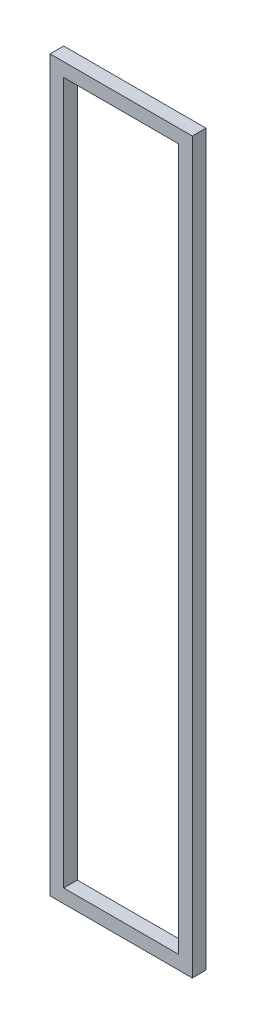
ISO-10303-21;
HEADER;
FILE_DESCRIPTION(('STEP AP214'),'2;1');
FILE_NAME('part.step','',(''),(''),'','','');
FILE_SCHEMA(('AUTOMOTIVE_DESIGN { 1 0 10303 214 1 1 1 1 }'));
ENDSEC;
DATA;
#1=APPLICATION_CONTEXT('core data for automotive mechanical design processes');
#2=APPLICATION_PROTOCOL_DEFINITION('international standard','automotive_design',2000,#1);
#3=PRODUCT_CONTEXT('',#1,'mechanical');
#4=PRODUCT('Part','Part','',(#3));
#5=PRODUCT_RELATED_PRODUCT_CATEGORY('part','',(#4));
#6=PRODUCT_DEFINITION_FORMATION('','',#4);
#7=PRODUCT_DEFINITION_CONTEXT('part definition',#1,'design');
#8=PRODUCT_DEFINITION('design','',#6,#7);
#9=PRODUCT_DEFINITION_SHAPE('','',#8);
#10=(LENGTH_UNIT() NAMED_UNIT(*) SI_UNIT(.MILLI.,.METRE.));
#11=(NAMED_UNIT(*) PLANE_ANGLE_UNIT() SI_UNIT($,.RADIAN.));
#12=(NAMED_UNIT(*) SI_UNIT($,.STERADIAN.) SOLID_ANGLE_UNIT());
#13=UNCERTAINTY_MEASURE_WITH_UNIT(LENGTH_MEASURE(1.E-05),#10,'distance_accuracy_value','');
#14=(GEOMETRIC_REPRESENTATION_CONTEXT(3) GLOBAL_UNCERTAINTY_ASSIGNED_CONTEXT((#13)) GLOBAL_UNIT_ASSIGNED_CONTEXT((#10,
#11,#12)) REPRESENTATION_CONTEXT('',''));
#15=CARTESIAN_POINT('',(0.,0.,0.));
#16=DIRECTION('',(0.,0.,1.));
#17=DIRECTION('',(1.,0.,0.));
#18=AXIS2_PLACEMENT_3D('',#15,#16,#17);
#19=CARTESIAN_POINT('',(-38.2902803457485,-34.428563040232,25.4));
#20=DIRECTION('',(0.,0.,1.));
#21=DIRECTION('',(1.,0.,0.));
#22=AXIS2_PLACEMENT_3D('',#19,#20,#21);
#23=PLANE('',#22);
#24=DIRECTION('',(0.,-1.,0.));
#25=VECTOR('',#24,1.);
#26=CARTESIAN_POINT('',(-38.2902803457487,1324.47143695977,25.4));
#27=LINE('',#26,#25);
#28=CARTESIAN_POINT('',(-38.2902803457487,1324.47143695977,25.4));
#29=VERTEX_POINT('',#28);
#30=CARTESIAN_POINT('',(-38.2902803457485,-34.428563040232,25.4));
#31=VERTEX_POINT('',#30);
#32=EDGE_CURVE('E131',#29,#31,#27,.T.);
#33=ORIENTED_EDGE('',*,*,#32,.T.);
#34=DIRECTION('',(1.,0.,0.));
#35=VECTOR('',#34,1.);
#36=CARTESIAN_POINT('',(-38.2902803457485,-34.428563040232,25.4));
#37=LINE('',#36,#35);
#38=CARTESIAN_POINT('',(226.834919654251,-34.428563040232,25.4));
#39=VERTEX_POINT('',#38);
#40=EDGE_CURVE('E134',#31,#39,#37,.T.);
#41=ORIENTED_EDGE('',*,*,#40,.T.);
#42=DIRECTION('',(0.,1.,0.));
#43=VECTOR('',#42,1.);
#44=CARTESIAN_POINT('',(226.834919654251,1324.47143695977,25.4));
#45=LINE('',#44,#43);
#46=CARTESIAN_POINT('',(226.834919654251,1324.47143695977,25.4));
#47=VERTEX_POINT('',#46);
#48=EDGE_CURVE('E137',#39,#47,#45,.T.);
#49=ORIENTED_EDGE('',*,*,#48,.T.);
#50=DIRECTION('',(-1.,0.,0.));
#51=VECTOR('',#50,1.);
#52=CARTESIAN_POINT('',(-38.2902803457487,1324.47143695977,25.4));
#53=LINE('',#52,#51);
#54=EDGE_CURVE('E139',#47,#29,#53,.T.);
#55=ORIENTED_EDGE('',*,*,#54,.T.);
#56=EDGE_LOOP('',(#33,#41,#49,#55));
#57=FACE_BOUND('',#56,.T.);
#58=DIRECTION('',(1.,0.,0.));
#59=VECTOR('',#58,1.);
#60=CARTESIAN_POINT('',(-12.8902803457485,-9.02856304023204,25.4));
#61=LINE('',#60,#59);
#62=CARTESIAN_POINT('',(-12.8902803457485,-9.02856304023204,25.4));
#63=VERTEX_POINT('',#62);
#64=CARTESIAN_POINT('',(201.434919654251,-9.02856304023204,25.4));
#65=VERTEX_POINT('',#64);
#66=EDGE_CURVE('E103',#63,#65,#61,.T.);
#67=ORIENTED_EDGE('',*,*,#66,.F.);
#68=DIRECTION('',(0.,-1.,0.));
#69=VECTOR('',#68,1.);
#70=CARTESIAN_POINT('',(-12.8902803457487,1299.07143695977,25.4));
#71=LINE('',#70,#69);
#72=CARTESIAN_POINT('',(-12.8902803457487,1299.07143695977,25.4));
#73=VERTEX_POINT('',#72);
#74=EDGE_CURVE('E95',#73,#63,#71,.T.);
#75=ORIENTED_EDGE('',*,*,#74,.F.);
#76=DIRECTION('',(-1.,0.,0.));
#77=VECTOR('',#76,1.);
#78=CARTESIAN_POINT('',(-12.8902803457487,1299.07143695977,25.4));
#79=LINE('',#78,#77);
#80=CARTESIAN_POINT('',(201.434919654251,1299.07143695977,25.4));
#81=VERTEX_POINT('',#80);
#82=EDGE_CURVE('E117',#81,#73,#79,.T.);
#83=ORIENTED_EDGE('',*,*,#82,.F.);
#84=DIRECTION('',(0.,1.,0.));
#85=VECTOR('',#84,1.);
#86=CARTESIAN_POINT('',(201.434919654251,1299.07143695977,25.4));
#87=LINE('',#86,#85);
#88=EDGE_CURVE('E115',#65,#81,#87,.T.);
#89=ORIENTED_EDGE('',*,*,#88,.F.);
#90=EDGE_LOOP('',(#67,#75,#83,#89));
#91=FACE_BOUND('',#90,.T.);
#92=ADVANCED_FACE('F30',(#57,#91),#23,.T.);
#93=CARTESIAN_POINT('',(-38.2902803457485,-34.428563040232,0.));
#94=DIRECTION('',(0.,0.,1.));
#95=DIRECTION('',(1.,0.,0.));
#96=AXIS2_PLACEMENT_3D('',#93,#94,#95);
#97=PLANE('',#96);
#98=DIRECTION('',(0.,-1.,0.));
#99=VECTOR('',#98,1.);
#100=CARTESIAN_POINT('',(-38.2902803457487,1324.47143695977,0.));
#101=LINE('',#100,#99);
#102=CARTESIAN_POINT('',(-38.2902803457487,1324.47143695977,0.));
#103=VERTEX_POINT('',#102);
#104=CARTESIAN_POINT('',(-38.2902803457485,-34.428563040232,0.));
#105=VERTEX_POINT('',#104);
#106=EDGE_CURVE('E111',#103,#105,#101,.T.);
#107=ORIENTED_EDGE('',*,*,#106,.F.);
#108=DIRECTION('',(-1.,0.,0.));
#109=VECTOR('',#108,1.);
#110=CARTESIAN_POINT('',(-38.2902803457487,1324.47143695977,0.));
#111=LINE('',#110,#109);
#112=CARTESIAN_POINT('',(226.834919654251,1324.47143695977,0.));
#113=VERTEX_POINT('',#112);
#114=EDGE_CURVE('E135',#113,#103,#111,.T.);
#115=ORIENTED_EDGE('',*,*,#114,.F.);
#116=DIRECTION('',(0.,1.,0.));
#117=VECTOR('',#116,1.);
#118=CARTESIAN_POINT('',(226.834919654251,1324.47143695977,0.));
#119=LINE('',#118,#117);
#120=CARTESIAN_POINT('',(226.834919654251,-34.428563040232,0.));
#121=VERTEX_POINT('',#120);
#122=EDGE_CURVE('E146',#121,#113,#119,.T.);
#123=ORIENTED_EDGE('',*,*,#122,.F.);
#124=DIRECTION('',(1.,0.,0.));
#125=VECTOR('',#124,1.);
#126=CARTESIAN_POINT('',(-38.2902803457485,-34.428563040232,0.));
#127=LINE('',#126,#125);
#128=EDGE_CURVE('E144',#105,#121,#127,.T.);
#129=ORIENTED_EDGE('',*,*,#128,.F.);
#130=EDGE_LOOP('',(#107,#115,#123,#129));
#131=FACE_BOUND('',#130,.T.);
#132=DIRECTION('',(0.,-1.,0.));
#133=VECTOR('',#132,1.);
#134=CARTESIAN_POINT('',(-12.8902803457487,1299.07143695977,0.));
#135=LINE('',#134,#133);
#136=CARTESIAN_POINT('',(-12.8902803457487,1299.07143695977,0.));
#137=VERTEX_POINT('',#136);
#138=CARTESIAN_POINT('',(-12.8902803457485,-9.02856304023204,0.));
#139=VERTEX_POINT('',#138);
#140=EDGE_CURVE('E53',#137,#139,#135,.T.);
#141=ORIENTED_EDGE('',*,*,#140,.T.);
#142=DIRECTION('',(1.,0.,0.));
#143=VECTOR('',#142,1.);
#144=CARTESIAN_POINT('',(-12.8902803457485,-9.02856304023204,0.));
#145=LINE('',#144,#143);
#146=CARTESIAN_POINT('',(201.434919654251,-9.02856304023204,0.));
#147=VERTEX_POINT('',#146);
#148=EDGE_CURVE('E110',#139,#147,#145,.T.);
#149=ORIENTED_EDGE('',*,*,#148,.T.);
#150=DIRECTION('',(0.,1.,0.));
#151=VECTOR('',#150,1.);
#152=CARTESIAN_POINT('',(201.434919654251,1299.07143695977,0.));
#153=LINE('',#152,#151);
#154=CARTESIAN_POINT('',(201.434919654251,1299.07143695977,0.));
#155=VERTEX_POINT('',#154);
#156=EDGE_CURVE('E123',#147,#155,#153,.T.);
#157=ORIENTED_EDGE('',*,*,#156,.T.);
#158=DIRECTION('',(-1.,0.,0.));
#159=VECTOR('',#158,1.);
#160=CARTESIAN_POINT('',(-12.8902803457487,1299.07143695977,0.));
#161=LINE('',#160,#159);
#162=EDGE_CURVE('E104',#155,#137,#161,.T.);
#163=ORIENTED_EDGE('',*,*,#162,.T.);
#164=EDGE_LOOP('',(#141,#149,#157,#163));
#165=FACE_BOUND('',#164,.T.);
#166=ADVANCED_FACE('F164',(#131,#165),#97,.F.);
#167=CARTESIAN_POINT('',(-38.2902803457487,1324.47143695977,25.4));
#168=DIRECTION('',(1.,0.,0.));
#169=DIRECTION('',(0.,1.,0.));
#170=AXIS2_PLACEMENT_3D('',#167,#168,#169);
#171=PLANE('',#170);
#172=ORIENTED_EDGE('',*,*,#106,.T.);
#173=DIRECTION('',(0.,0.,-1.));
#174=VECTOR('',#173,1.);
#175=CARTESIAN_POINT('',(-38.2902803457485,-34.428563040232,25.4));
#176=LINE('',#175,#174);
#177=EDGE_CURVE('E11',#31,#105,#176,.T.);
#178=ORIENTED_EDGE('',*,*,#177,.F.);
#179=ORIENTED_EDGE('',*,*,#32,.F.);
#180=DIRECTION('',(0.,0.,-1.));
#181=VECTOR('',#180,1.);
#182=CARTESIAN_POINT('',(-38.2902803457487,1324.47143695977,25.4));
#183=LINE('',#182,#181);
#184=EDGE_CURVE('E141',#29,#103,#183,.T.);
#185=ORIENTED_EDGE('',*,*,#184,.T.);
#186=EDGE_LOOP('',(#172,#178,#179,#185));
#187=FACE_BOUND('',#186,.T.);
#188=ADVANCED_FACE('F32',(#187),#171,.F.);
#189=CARTESIAN_POINT('',(-38.2902803457485,-34.428563040232,25.4));
#190=DIRECTION('',(0.,1.,0.));
#191=DIRECTION('',(0.,0.,1.));
#192=AXIS2_PLACEMENT_3D('',#189,#190,#191);
#193=PLANE('',#192);
#194=ORIENTED_EDGE('',*,*,#128,.T.);
#195=DIRECTION('',(0.,0.,-1.));
#196=VECTOR('',#195,1.);
#197=CARTESIAN_POINT('',(226.834919654251,-34.428563040232,25.4));
#198=LINE('',#197,#196);
#199=EDGE_CURVE('E38',#39,#121,#198,.T.);
#200=ORIENTED_EDGE('',*,*,#199,.F.);
#201=ORIENTED_EDGE('',*,*,#40,.F.);
#202=ORIENTED_EDGE('',*,*,#177,.T.);
#203=EDGE_LOOP('',(#194,#200,#201,#202));
#204=FACE_BOUND('',#203,.T.);
#205=ADVANCED_FACE('F174',(#204),#193,.F.);
#206=CARTESIAN_POINT('',(226.834919654251,1324.47143695977,25.4));
#207=DIRECTION('',(-1.,0.,0.));
#208=DIRECTION('',(0.,-1.,0.));
#209=AXIS2_PLACEMENT_3D('',#206,#207,#208);
#210=PLANE('',#209);
#211=ORIENTED_EDGE('',*,*,#122,.T.);
#212=DIRECTION('',(0.,0.,-1.));
#213=VECTOR('',#212,1.);
#214=CARTESIAN_POINT('',(226.834919654251,1324.47143695977,25.4));
#215=LINE('',#214,#213);
#216=EDGE_CURVE('E151',#47,#113,#215,.T.);
#217=ORIENTED_EDGE('',*,*,#216,.F.);
#218=ORIENTED_EDGE('',*,*,#48,.F.);
#219=ORIENTED_EDGE('',*,*,#199,.T.);
#220=EDGE_LOOP('',(#211,#217,#218,#219));
#221=FACE_BOUND('',#220,.T.);
#222=ADVANCED_FACE('F158',(#221),#210,.F.);
#223=CARTESIAN_POINT('',(-38.2902803457487,1324.47143695977,25.4));
#224=DIRECTION('',(0.,-1.,0.));
#225=DIRECTION('',(0.,0.,-1.));
#226=AXIS2_PLACEMENT_3D('',#223,#224,#225);
#227=PLANE('',#226);
#228=ORIENTED_EDGE('',*,*,#114,.T.);
#229=ORIENTED_EDGE('',*,*,#184,.F.);
#230=ORIENTED_EDGE('',*,*,#54,.F.);
#231=ORIENTED_EDGE('',*,*,#216,.T.);
#232=EDGE_LOOP('',(#228,#229,#230,#231));
#233=FACE_BOUND('',#232,.T.);
#234=ADVANCED_FACE('F168',(#233),#227,.F.);
#235=CARTESIAN_POINT('',(-12.8902803457487,1299.07143695977,25.4));
#236=DIRECTION('',(1.,0.,0.));
#237=DIRECTION('',(0.,1.,0.));
#238=AXIS2_PLACEMENT_3D('',#235,#236,#237);
#239=PLANE('',#238);
#240=ORIENTED_EDGE('',*,*,#140,.F.);
#241=DIRECTION('',(0.,0.,-1.));
#242=VECTOR('',#241,1.);
#243=CARTESIAN_POINT('',(-12.8902803457487,1299.07143695977,25.4));
#244=LINE('',#243,#242);
#245=EDGE_CURVE('E99',#73,#137,#244,.T.);
#246=ORIENTED_EDGE('',*,*,#245,.F.);
#247=ORIENTED_EDGE('',*,*,#74,.T.);
#248=DIRECTION('',(0.,0.,-1.));
#249=VECTOR('',#248,1.);
#250=CARTESIAN_POINT('',(-12.8902803457485,-9.02856304023204,25.4));
#251=LINE('',#250,#249);
#252=EDGE_CURVE('E98',#63,#139,#251,.T.);
#253=ORIENTED_EDGE('',*,*,#252,.T.);
#254=EDGE_LOOP('',(#240,#246,#247,#253));
#255=FACE_BOUND('',#254,.T.);
#256=ADVANCED_FACE('F97',(#255),#239,.T.);
#257=CARTESIAN_POINT('',(-12.8902803457485,-9.02856304023204,25.4));
#258=DIRECTION('',(0.,1.,0.));
#259=DIRECTION('',(0.,0.,1.));
#260=AXIS2_PLACEMENT_3D('',#257,#258,#259);
#261=PLANE('',#260);
#262=ORIENTED_EDGE('',*,*,#148,.F.);
#263=ORIENTED_EDGE('',*,*,#252,.F.);
#264=ORIENTED_EDGE('',*,*,#66,.T.);
#265=DIRECTION('',(0.,0.,-1.));
#266=VECTOR('',#265,1.);
#267=CARTESIAN_POINT('',(201.434919654251,-9.02856304023204,25.4));
#268=LINE('',#267,#266);
#269=EDGE_CURVE('E112',#65,#147,#268,.T.);
#270=ORIENTED_EDGE('',*,*,#269,.T.);
#271=EDGE_LOOP('',(#262,#263,#264,#270));
#272=FACE_BOUND('',#271,.T.);
#273=ADVANCED_FACE('F107',(#272),#261,.T.);
#274=CARTESIAN_POINT('',(201.434919654251,1299.07143695977,25.4));
#275=DIRECTION('',(-1.,0.,0.));
#276=DIRECTION('',(0.,-1.,0.));
#277=AXIS2_PLACEMENT_3D('',#274,#275,#276);
#278=PLANE('',#277);
#279=ORIENTED_EDGE('',*,*,#156,.F.);
#280=ORIENTED_EDGE('',*,*,#269,.F.);
#281=ORIENTED_EDGE('',*,*,#88,.T.);
#282=DIRECTION('',(0.,0.,-1.));
#283=VECTOR('',#282,1.);
#284=CARTESIAN_POINT('',(201.434919654251,1299.07143695977,25.4));
#285=LINE('',#284,#283);
#286=EDGE_CURVE('E45',#81,#155,#285,.T.);
#287=ORIENTED_EDGE('',*,*,#286,.T.);
#288=EDGE_LOOP('',(#279,#280,#281,#287));
#289=FACE_BOUND('',#288,.T.);
#290=ADVANCED_FACE('F197',(#289),#278,.T.);
#291=CARTESIAN_POINT('',(-12.8902803457487,1299.07143695977,25.4));
#292=DIRECTION('',(0.,-1.,0.));
#293=DIRECTION('',(0.,0.,-1.));
#294=AXIS2_PLACEMENT_3D('',#291,#292,#293);
#295=PLANE('',#294);
#296=ORIENTED_EDGE('',*,*,#162,.F.);
#297=ORIENTED_EDGE('',*,*,#286,.F.);
#298=ORIENTED_EDGE('',*,*,#82,.T.);
#299=ORIENTED_EDGE('',*,*,#245,.T.);
#300=EDGE_LOOP('',(#296,#297,#298,#299));
#301=FACE_BOUND('',#300,.T.);
#302=ADVANCED_FACE('F201',(#301),#295,.T.);
#303=CLOSED_SHELL('',(#92,#166,#188,#205,#222,#234,#256,#273,#290,#302));
#304=MANIFOLD_SOLID_BREP('B2',#303);
#305=ADVANCED_BREP_SHAPE_REPRESENTATION('',(#18,#304),#14);
#306=SHAPE_DEFINITION_REPRESENTATION(#9,#305);
ENDSEC;
END-ISO-10303-21;
